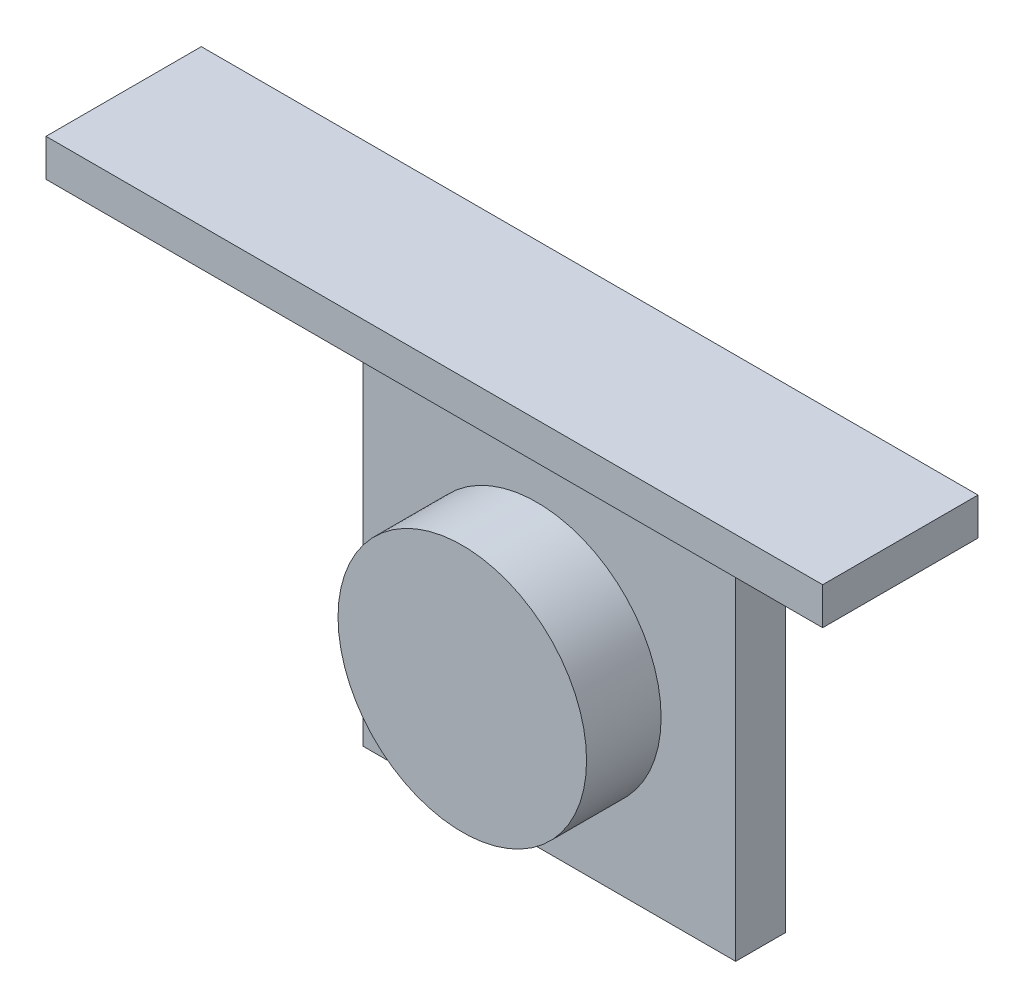
ISO-10303-21;
HEADER;
FILE_DESCRIPTION(('STEP AP214'),'2;1');
FILE_NAME('part.step','',(''),(''),'','','');
FILE_SCHEMA(('AUTOMOTIVE_DESIGN { 1 0 10303 214 1 1 1 1 }'));
ENDSEC;
DATA;
#1=APPLICATION_CONTEXT('core data for automotive mechanical design processes');
#2=APPLICATION_PROTOCOL_DEFINITION('international standard','automotive_design',2000,#1);
#3=PRODUCT_CONTEXT('',#1,'mechanical');
#4=PRODUCT('Part','Part','',(#3));
#5=PRODUCT_RELATED_PRODUCT_CATEGORY('part','',(#4));
#6=PRODUCT_DEFINITION_FORMATION('','',#4);
#7=PRODUCT_DEFINITION_CONTEXT('part definition',#1,'design');
#8=PRODUCT_DEFINITION('design','',#6,#7);
#9=PRODUCT_DEFINITION_SHAPE('','',#8);
#10=(LENGTH_UNIT() NAMED_UNIT(*) SI_UNIT(.MILLI.,.METRE.));
#11=(NAMED_UNIT(*) PLANE_ANGLE_UNIT() SI_UNIT($,.RADIAN.));
#12=(NAMED_UNIT(*) SI_UNIT($,.STERADIAN.) SOLID_ANGLE_UNIT());
#13=UNCERTAINTY_MEASURE_WITH_UNIT(LENGTH_MEASURE(1.E-05),#10,'distance_accuracy_value','');
#14=(GEOMETRIC_REPRESENTATION_CONTEXT(3) GLOBAL_UNCERTAINTY_ASSIGNED_CONTEXT((#13)) GLOBAL_UNIT_ASSIGNED_CONTEXT((#10,
#11,#12)) REPRESENTATION_CONTEXT('',''));
#15=CARTESIAN_POINT('',(0.,0.,0.));
#16=DIRECTION('',(0.,0.,1.));
#17=DIRECTION('',(1.,0.,0.));
#18=AXIS2_PLACEMENT_3D('',#15,#16,#17);
#19=CARTESIAN_POINT('',(12.5,8.4,4.5));
#20=DIRECTION('',(-1.,0.,0.));
#21=DIRECTION('',(0.,0.,1.));
#22=AXIS2_PLACEMENT_3D('',#19,#20,#21);
#23=PLANE('',#22);
#24=DIRECTION('',(0.,1.,0.));
#25=VECTOR('',#24,1.);
#26=CARTESIAN_POINT('',(12.5,8.4,-0.5));
#27=LINE('',#26,#25);
#28=CARTESIAN_POINT('',(12.5,8.4,-0.5));
#29=VERTEX_POINT('',#28);
#30=CARTESIAN_POINT('',(12.5,9.6,-0.5));
#31=VERTEX_POINT('',#30);
#32=EDGE_CURVE('E107',#29,#31,#27,.T.);
#33=ORIENTED_EDGE('',*,*,#32,.T.);
#34=DIRECTION('',(0.,0.,-1.));
#35=VECTOR('',#34,1.);
#36=CARTESIAN_POINT('',(12.5,9.6,4.5));
#37=LINE('',#36,#35);
#38=CARTESIAN_POINT('',(12.5,9.6,4.5));
#39=VERTEX_POINT('',#38);
#40=EDGE_CURVE('E12',#39,#31,#37,.T.);
#41=ORIENTED_EDGE('',*,*,#40,.F.);
#42=DIRECTION('',(0.,1.,0.));
#43=VECTOR('',#42,1.);
#44=CARTESIAN_POINT('',(12.5,8.4,4.5));
#45=LINE('',#44,#43);
#46=CARTESIAN_POINT('',(12.5,8.4,4.5));
#47=VERTEX_POINT('',#46);
#48=EDGE_CURVE('E95',#47,#39,#45,.T.);
#49=ORIENTED_EDGE('',*,*,#48,.F.);
#50=DIRECTION('',(0.,0.,-1.));
#51=VECTOR('',#50,1.);
#52=CARTESIAN_POINT('',(12.5,8.4,4.5));
#53=LINE('',#52,#51);
#54=EDGE_CURVE('E103',#47,#29,#53,.T.);
#55=ORIENTED_EDGE('',*,*,#54,.T.);
#56=EDGE_LOOP('',(#33,#41,#49,#55));
#57=FACE_BOUND('',#56,.T.);
#58=ADVANCED_FACE('F44',(#57),#23,.F.);
#59=CARTESIAN_POINT('',(-12.5,9.6,4.5));
#60=DIRECTION('',(0.,-1.,0.));
#61=DIRECTION('',(0.,0.,-1.));
#62=AXIS2_PLACEMENT_3D('',#59,#60,#61);
#63=PLANE('',#62);
#64=DIRECTION('',(-1.,0.,0.));
#65=VECTOR('',#64,1.);
#66=CARTESIAN_POINT('',(-12.5,9.6,-0.5));
#67=LINE('',#66,#65);
#68=CARTESIAN_POINT('',(-12.5,9.6,-0.5));
#69=VERTEX_POINT('',#68);
#70=EDGE_CURVE('E99',#31,#69,#67,.T.);
#71=ORIENTED_EDGE('',*,*,#70,.T.);
#72=DIRECTION('',(0.,0.,-1.));
#73=VECTOR('',#72,1.);
#74=CARTESIAN_POINT('',(-12.5,9.6,4.5));
#75=LINE('',#74,#73);
#76=CARTESIAN_POINT('',(-12.5,9.6,4.5));
#77=VERTEX_POINT('',#76);
#78=EDGE_CURVE('E52',#77,#69,#75,.T.);
#79=ORIENTED_EDGE('',*,*,#78,.F.);
#80=DIRECTION('',(-1.,0.,0.));
#81=VECTOR('',#80,1.);
#82=CARTESIAN_POINT('',(-12.5,9.6,4.5));
#83=LINE('',#82,#81);
#84=EDGE_CURVE('E90',#39,#77,#83,.T.);
#85=ORIENTED_EDGE('',*,*,#84,.F.);
#86=ORIENTED_EDGE('',*,*,#40,.T.);
#87=EDGE_LOOP('',(#71,#79,#85,#86));
#88=FACE_BOUND('',#87,.T.);
#89=ADVANCED_FACE('F98',(#88),#63,.F.);
#90=CARTESIAN_POINT('',(-12.5,8.4,4.5));
#91=DIRECTION('',(1.,0.,0.));
#92=DIRECTION('',(0.,0.,-1.));
#93=AXIS2_PLACEMENT_3D('',#90,#91,#92);
#94=PLANE('',#93);
#95=DIRECTION('',(0.,-1.,0.));
#96=VECTOR('',#95,1.);
#97=CARTESIAN_POINT('',(-12.5,8.4,-0.5));
#98=LINE('',#97,#96);
#99=CARTESIAN_POINT('',(-12.5,8.4,-0.5));
#100=VERTEX_POINT('',#99);
#101=EDGE_CURVE('E77',#69,#100,#98,.T.);
#102=ORIENTED_EDGE('',*,*,#101,.T.);
#103=DIRECTION('',(0.,0.,-1.));
#104=VECTOR('',#103,1.);
#105=CARTESIAN_POINT('',(-12.5,8.4,4.5));
#106=LINE('',#105,#104);
#107=CARTESIAN_POINT('',(-12.5,8.4,4.5));
#108=VERTEX_POINT('',#107);
#109=EDGE_CURVE('E100',#108,#100,#106,.T.);
#110=ORIENTED_EDGE('',*,*,#109,.F.);
#111=DIRECTION('',(0.,-1.,0.));
#112=VECTOR('',#111,1.);
#113=CARTESIAN_POINT('',(-12.5,8.4,4.5));
#114=LINE('',#113,#112);
#115=EDGE_CURVE('E93',#77,#108,#114,.T.);
#116=ORIENTED_EDGE('',*,*,#115,.F.);
#117=ORIENTED_EDGE('',*,*,#78,.T.);
#118=EDGE_LOOP('',(#102,#110,#116,#117));
#119=FACE_BOUND('',#118,.T.);
#120=ADVANCED_FACE('F101',(#119),#94,.F.);
#121=CARTESIAN_POINT('',(-12.5,8.4,4.5));
#122=DIRECTION('',(0.,1.,0.));
#123=DIRECTION('',(0.,0.,1.));
#124=AXIS2_PLACEMENT_3D('',#121,#122,#123);
#125=PLANE('',#124);
#126=DIRECTION('',(1.,0.,0.));
#127=VECTOR('',#126,1.);
#128=CARTESIAN_POINT('',(-12.5,8.4,-0.5));
#129=LINE('',#128,#127);
#130=EDGE_CURVE('E83',#100,#29,#129,.T.);
#131=ORIENTED_EDGE('',*,*,#130,.T.);
#132=ORIENTED_EDGE('',*,*,#54,.F.);
#133=DIRECTION('',(1.,0.,0.));
#134=VECTOR('',#133,1.);
#135=CARTESIAN_POINT('',(-12.5,8.4,4.5));
#136=LINE('',#135,#134);
#137=EDGE_CURVE('E60',#108,#47,#136,.T.);
#138=ORIENTED_EDGE('',*,*,#137,.F.);
#139=ORIENTED_EDGE('',*,*,#109,.T.);
#140=EDGE_LOOP('',(#131,#132,#138,#139));
#141=FACE_BOUND('',#140,.T.);
#142=ADVANCED_FACE('F114',(#141),#125,.F.);
#143=CARTESIAN_POINT('',(0.,0.,4.5));
#144=DIRECTION('',(0.,0.,-1.));
#145=DIRECTION('',(-1.,0.,0.));
#146=AXIS2_PLACEMENT_3D('',#143,#144,#145);
#147=PLANE('',#146);
#148=ORIENTED_EDGE('',*,*,#48,.T.);
#149=ORIENTED_EDGE('',*,*,#84,.T.);
#150=ORIENTED_EDGE('',*,*,#115,.T.);
#151=ORIENTED_EDGE('',*,*,#137,.T.);
#152=EDGE_LOOP('',(#148,#149,#150,#151));
#153=FACE_BOUND('',#152,.T.);
#154=ADVANCED_FACE('F91',(#153),#147,.F.);
#155=CARTESIAN_POINT('',(0.,0.,-0.5));
#156=DIRECTION('',(0.,0.,-1.));
#157=DIRECTION('',(-1.,0.,0.));
#158=AXIS2_PLACEMENT_3D('',#155,#156,#157);
#159=PLANE('',#158);
#160=ORIENTED_EDGE('',*,*,#32,.F.);
#161=ORIENTED_EDGE('',*,*,#130,.F.);
#162=ORIENTED_EDGE('',*,*,#101,.F.);
#163=ORIENTED_EDGE('',*,*,#70,.F.);
#164=EDGE_LOOP('',(#160,#161,#162,#163));
#165=FACE_BOUND('',#164,.T.);
#166=ADVANCED_FACE('F117',(#165),#159,.T.);
#167=CLOSED_SHELL('',(#58,#89,#120,#142,#154,#166));
#168=MANIFOLD_SOLID_BREP('B2',#167);
#169=CARTESIAN_POINT('',(0.,0.,3.6));
#170=DIRECTION('',(0.,0.,-1.));
#171=DIRECTION('',(-1.,0.,0.));
#172=AXIS2_PLACEMENT_3D('',#169,#170,#171);
#173=CYLINDRICAL_SURFACE('',#172,4.);
#174=CARTESIAN_POINT('',(0.,0.,3.6));
#175=DIRECTION('',(0.,0.,1.));
#176=DIRECTION('',(1.,0.,0.));
#177=AXIS2_PLACEMENT_3D('',#174,#175,#176);
#178=CIRCLE('',#177,4.);
#179=CARTESIAN_POINT('',(4.,0.,3.6));
#180=VERTEX_POINT('',#179);
#181=EDGE_CURVE('E43',#180,#180,#178,.T.);
#182=ORIENTED_EDGE('',*,*,#181,.F.);
#183=EDGE_LOOP('',(#182));
#184=FACE_BOUND('',#183,.T.);
#185=CARTESIAN_POINT('',(0.,0.,1.2));
#186=DIRECTION('',(0.,0.,1.));
#187=DIRECTION('',(1.,0.,0.));
#188=AXIS2_PLACEMENT_3D('',#185,#186,#187);
#189=CIRCLE('',#188,4.);
#190=CARTESIAN_POINT('',(4.,0.,1.2));
#191=VERTEX_POINT('',#190);
#192=EDGE_CURVE('E180',#191,#191,#189,.T.);
#193=ORIENTED_EDGE('',*,*,#192,.T.);
#194=EDGE_LOOP('',(#193));
#195=FACE_BOUND('',#194,.T.);
#196=ADVANCED_FACE('F177',(#184,#195),#173,.T.);
#197=CARTESIAN_POINT('',(0.,0.,3.6));
#198=DIRECTION('',(0.,0.,1.));
#199=DIRECTION('',(1.,0.,0.));
#200=AXIS2_PLACEMENT_3D('',#197,#198,#199);
#201=PLANE('',#200);
#202=ORIENTED_EDGE('',*,*,#181,.T.);
#203=EDGE_LOOP('',(#202));
#204=FACE_BOUND('',#203,.T.);
#205=ADVANCED_FACE('F192',(#204),#201,.T.);
#206=CARTESIAN_POINT('',(0.,0.,1.2));
#207=DIRECTION('',(0.,0.,1.));
#208=DIRECTION('',(1.,0.,0.));
#209=AXIS2_PLACEMENT_3D('',#206,#207,#208);
#210=PLANE('',#209);
#211=ORIENTED_EDGE('',*,*,#192,.F.);
#212=EDGE_LOOP('',(#211));
#213=FACE_BOUND('',#212,.T.);
#214=ADVANCED_FACE('F190',(#213),#210,.F.);
#215=CLOSED_SHELL('',(#196,#205,#214));
#216=MANIFOLD_SOLID_BREP('B6',#215);
#217=CARTESIAN_POINT('',(6.,-6.,0.8));
#218=DIRECTION('',(-1.,0.,0.));
#219=DIRECTION('',(0.,0.,1.));
#220=AXIS2_PLACEMENT_3D('',#217,#218,#219);
#221=PLANE('',#220);
#222=DIRECTION('',(0.,1.,0.));
#223=VECTOR('',#222,1.);
#224=CARTESIAN_POINT('',(6.,-6.,-0.8));
#225=LINE('',#224,#223);
#226=CARTESIAN_POINT('',(6.,-6.,-0.8));
#227=VERTEX_POINT('',#226);
#228=CARTESIAN_POINT('',(6.,6.,-0.8));
#229=VERTEX_POINT('',#228);
#230=EDGE_CURVE('E281',#227,#229,#225,.T.);
#231=ORIENTED_EDGE('',*,*,#230,.T.);
#232=DIRECTION('',(0.,0.,-1.));
#233=VECTOR('',#232,1.);
#234=CARTESIAN_POINT('',(6.,6.,0.8));
#235=LINE('',#234,#233);
#236=CARTESIAN_POINT('',(6.,6.,0.8));
#237=VERTEX_POINT('',#236);
#238=EDGE_CURVE('E175',#237,#229,#235,.T.);
#239=ORIENTED_EDGE('',*,*,#238,.F.);
#240=DIRECTION('',(0.,1.,0.));
#241=VECTOR('',#240,1.);
#242=CARTESIAN_POINT('',(6.,-6.,0.8));
#243=LINE('',#242,#241);
#244=CARTESIAN_POINT('',(6.,-6.,0.8));
#245=VERTEX_POINT('',#244);
#246=EDGE_CURVE('E269',#245,#237,#243,.T.);
#247=ORIENTED_EDGE('',*,*,#246,.F.);
#248=DIRECTION('',(0.,0.,-1.));
#249=VECTOR('',#248,1.);
#250=CARTESIAN_POINT('',(6.,-6.,0.8));
#251=LINE('',#250,#249);
#252=EDGE_CURVE('E277',#245,#227,#251,.T.);
#253=ORIENTED_EDGE('',*,*,#252,.T.);
#254=EDGE_LOOP('',(#231,#239,#247,#253));
#255=FACE_BOUND('',#254,.T.);
#256=ADVANCED_FACE('F218',(#255),#221,.F.);
#257=CARTESIAN_POINT('',(-6.,6.,0.8));
#258=DIRECTION('',(0.,-1.,0.));
#259=DIRECTION('',(0.,0.,-1.));
#260=AXIS2_PLACEMENT_3D('',#257,#258,#259);
#261=PLANE('',#260);
#262=DIRECTION('',(-1.,0.,0.));
#263=VECTOR('',#262,1.);
#264=CARTESIAN_POINT('',(-6.,6.,-0.8));
#265=LINE('',#264,#263);
#266=CARTESIAN_POINT('',(-6.,6.,-0.8));
#267=VERTEX_POINT('',#266);
#268=EDGE_CURVE('E273',#229,#267,#265,.T.);
#269=ORIENTED_EDGE('',*,*,#268,.T.);
#270=DIRECTION('',(0.,0.,-1.));
#271=VECTOR('',#270,1.);
#272=CARTESIAN_POINT('',(-6.,6.,0.8));
#273=LINE('',#272,#271);
#274=CARTESIAN_POINT('',(-6.,6.,0.8));
#275=VERTEX_POINT('',#274);
#276=EDGE_CURVE('E226',#275,#267,#273,.T.);
#277=ORIENTED_EDGE('',*,*,#276,.F.);
#278=DIRECTION('',(-1.,0.,0.));
#279=VECTOR('',#278,1.);
#280=CARTESIAN_POINT('',(-6.,6.,0.8));
#281=LINE('',#280,#279);
#282=EDGE_CURVE('E264',#237,#275,#281,.T.);
#283=ORIENTED_EDGE('',*,*,#282,.F.);
#284=ORIENTED_EDGE('',*,*,#238,.T.);
#285=EDGE_LOOP('',(#269,#277,#283,#284));
#286=FACE_BOUND('',#285,.T.);
#287=ADVANCED_FACE('F272',(#286),#261,.F.);
#288=CARTESIAN_POINT('',(-6.,-6.,0.8));
#289=DIRECTION('',(1.,0.,0.));
#290=DIRECTION('',(0.,0.,-1.));
#291=AXIS2_PLACEMENT_3D('',#288,#289,#290);
#292=PLANE('',#291);
#293=DIRECTION('',(0.,-1.,0.));
#294=VECTOR('',#293,1.);
#295=CARTESIAN_POINT('',(-6.,-6.,-0.8));
#296=LINE('',#295,#294);
#297=CARTESIAN_POINT('',(-6.,-6.,-0.8));
#298=VERTEX_POINT('',#297);
#299=EDGE_CURVE('E251',#267,#298,#296,.T.);
#300=ORIENTED_EDGE('',*,*,#299,.T.);
#301=DIRECTION('',(0.,0.,-1.));
#302=VECTOR('',#301,1.);
#303=CARTESIAN_POINT('',(-6.,-6.,0.8));
#304=LINE('',#303,#302);
#305=CARTESIAN_POINT('',(-6.,-6.,0.8));
#306=VERTEX_POINT('',#305);
#307=EDGE_CURVE('E274',#306,#298,#304,.T.);
#308=ORIENTED_EDGE('',*,*,#307,.F.);
#309=DIRECTION('',(0.,-1.,0.));
#310=VECTOR('',#309,1.);
#311=CARTESIAN_POINT('',(-6.,-6.,0.8));
#312=LINE('',#311,#310);
#313=EDGE_CURVE('E267',#275,#306,#312,.T.);
#314=ORIENTED_EDGE('',*,*,#313,.F.);
#315=ORIENTED_EDGE('',*,*,#276,.T.);
#316=EDGE_LOOP('',(#300,#308,#314,#315));
#317=FACE_BOUND('',#316,.T.);
#318=ADVANCED_FACE('F275',(#317),#292,.F.);
#319=CARTESIAN_POINT('',(-6.,-6.,0.8));
#320=DIRECTION('',(0.,1.,0.));
#321=DIRECTION('',(0.,0.,1.));
#322=AXIS2_PLACEMENT_3D('',#319,#320,#321);
#323=PLANE('',#322);
#324=DIRECTION('',(1.,0.,0.));
#325=VECTOR('',#324,1.);
#326=CARTESIAN_POINT('',(-6.,-6.,-0.8));
#327=LINE('',#326,#325);
#328=EDGE_CURVE('E257',#298,#227,#327,.T.);
#329=ORIENTED_EDGE('',*,*,#328,.T.);
#330=ORIENTED_EDGE('',*,*,#252,.F.);
#331=DIRECTION('',(1.,0.,0.));
#332=VECTOR('',#331,1.);
#333=CARTESIAN_POINT('',(-6.,-6.,0.8));
#334=LINE('',#333,#332);
#335=EDGE_CURVE('E234',#306,#245,#334,.T.);
#336=ORIENTED_EDGE('',*,*,#335,.F.);
#337=ORIENTED_EDGE('',*,*,#307,.T.);
#338=EDGE_LOOP('',(#329,#330,#336,#337));
#339=FACE_BOUND('',#338,.T.);
#340=ADVANCED_FACE('F288',(#339),#323,.F.);
#341=CARTESIAN_POINT('',(0.,0.,0.8));
#342=DIRECTION('',(0.,0.,-1.));
#343=DIRECTION('',(-1.,0.,0.));
#344=AXIS2_PLACEMENT_3D('',#341,#342,#343);
#345=PLANE('',#344);
#346=ORIENTED_EDGE('',*,*,#246,.T.);
#347=ORIENTED_EDGE('',*,*,#282,.T.);
#348=ORIENTED_EDGE('',*,*,#313,.T.);
#349=ORIENTED_EDGE('',*,*,#335,.T.);
#350=EDGE_LOOP('',(#346,#347,#348,#349));
#351=FACE_BOUND('',#350,.T.);
#352=ADVANCED_FACE('F265',(#351),#345,.F.);
#353=CARTESIAN_POINT('',(0.,0.,-0.8));
#354=DIRECTION('',(0.,0.,-1.));
#355=DIRECTION('',(-1.,0.,0.));
#356=AXIS2_PLACEMENT_3D('',#353,#354,#355);
#357=PLANE('',#356);
#358=ORIENTED_EDGE('',*,*,#230,.F.);
#359=ORIENTED_EDGE('',*,*,#328,.F.);
#360=ORIENTED_EDGE('',*,*,#299,.F.);
#361=ORIENTED_EDGE('',*,*,#268,.F.);
#362=EDGE_LOOP('',(#358,#359,#360,#361));
#363=FACE_BOUND('',#362,.T.);
#364=ADVANCED_FACE('F291',(#363),#357,.T.);
#365=CLOSED_SHELL('',(#256,#287,#318,#340,#352,#364));
#366=MANIFOLD_SOLID_BREP('B38',#365);
#367=ADVANCED_BREP_SHAPE_REPRESENTATION('',(#18,#168,#216,#366),#14);
#368=SHAPE_DEFINITION_REPRESENTATION(#9,#367);
ENDSEC;
END-ISO-10303-21;
